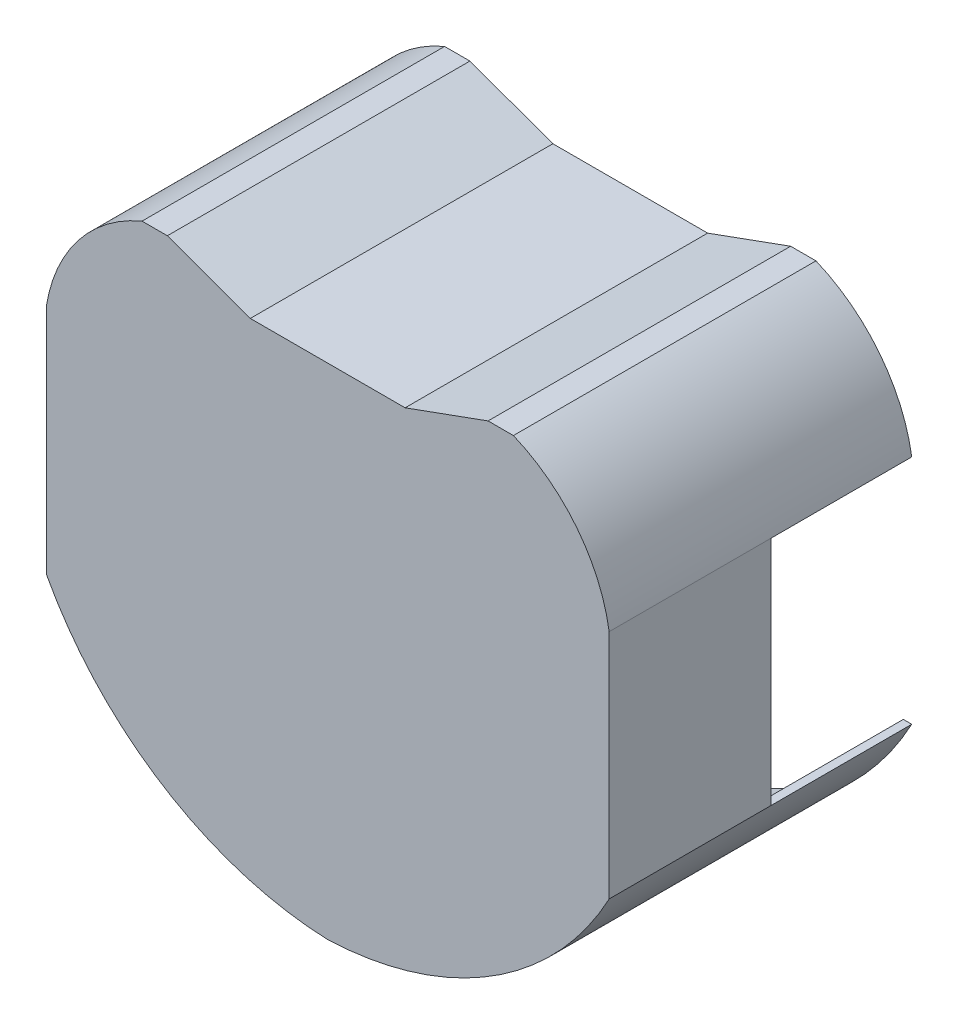
ISO-10303-21;
HEADER;
FILE_DESCRIPTION(('STEP AP214'),'2;1');
FILE_NAME('part.step','',(''),(''),'','','');
FILE_SCHEMA(('AUTOMOTIVE_DESIGN { 1 0 10303 214 1 1 1 1 }'));
ENDSEC;
DATA;
#1=APPLICATION_CONTEXT('core data for automotive mechanical design processes');
#2=APPLICATION_PROTOCOL_DEFINITION('international standard','automotive_design',2000,#1);
#3=PRODUCT_CONTEXT('',#1,'mechanical');
#4=PRODUCT('Part','Part','',(#3));
#5=PRODUCT_RELATED_PRODUCT_CATEGORY('part','',(#4));
#6=PRODUCT_DEFINITION_FORMATION('','',#4);
#7=PRODUCT_DEFINITION_CONTEXT('part definition',#1,'design');
#8=PRODUCT_DEFINITION('design','',#6,#7);
#9=PRODUCT_DEFINITION_SHAPE('','',#8);
#10=(LENGTH_UNIT() NAMED_UNIT(*) SI_UNIT(.MILLI.,.METRE.));
#11=(NAMED_UNIT(*) PLANE_ANGLE_UNIT() SI_UNIT($,.RADIAN.));
#12=(NAMED_UNIT(*) SI_UNIT($,.STERADIAN.) SOLID_ANGLE_UNIT());
#13=UNCERTAINTY_MEASURE_WITH_UNIT(LENGTH_MEASURE(1.E-05),#10,'distance_accuracy_value','');
#14=(GEOMETRIC_REPRESENTATION_CONTEXT(3) GLOBAL_UNCERTAINTY_ASSIGNED_CONTEXT((#13)) GLOBAL_UNIT_ASSIGNED_CONTEXT((#10,
#11,#12)) REPRESENTATION_CONTEXT('',''));
#15=CARTESIAN_POINT('',(0.,0.,0.));
#16=DIRECTION('',(0.,0.,1.));
#17=DIRECTION('',(1.,0.,0.));
#18=AXIS2_PLACEMENT_3D('',#15,#16,#17);
#19=CARTESIAN_POINT('',(-1.26072058426428,9.06990961477015,0.));
#20=DIRECTION('',(0.,0.,-1.));
#21=DIRECTION('',(-1.,0.,0.));
#22=AXIS2_PLACEMENT_3D('',#19,#20,#21);
#23=PLANE('',#22);
#24=DIRECTION('',(-1.,0.,0.));
#25=VECTOR('',#24,1.);
#26=CARTESIAN_POINT('',(-1.15725317286521E-13,-13.3422206927082,0.));
#27=LINE('',#26,#25);
#28=CARTESIAN_POINT('',(-38.2301383103759,-13.3422206927078,0.));
#29=VERTEX_POINT('',#28);
#30=CARTESIAN_POINT('',(-39.4301383103759,-13.3422206927078,0.));
#31=VERTEX_POINT('',#30);
#32=EDGE_CURVE('E50',#29,#31,#27,.T.);
#33=ORIENTED_EDGE('',*,*,#32,.T.);
#34=DIRECTION('',(0.,-1.,0.));
#35=VECTOR('',#34,1.);
#36=CARTESIAN_POINT('',(-39.4301383103759,-13.3422206927079,0.));
#37=LINE('',#36,#35);
#38=CARTESIAN_POINT('',(-39.4301383103759,19.5563760209377,0.));
#39=VERTEX_POINT('',#38);
#40=EDGE_CURVE('E414',#39,#31,#37,.T.);
#41=ORIENTED_EDGE('',*,*,#40,.F.);
#42=DIRECTION('',(1.,0.,0.));
#43=VECTOR('',#42,1.);
#44=CARTESIAN_POINT('',(3.39249045885491E-13,19.556376020937,0.));
#45=LINE('',#44,#43);
#46=CARTESIAN_POINT('',(-38.2301383103759,19.5563760209377,0.));
#47=VERTEX_POINT('',#46);
#48=EDGE_CURVE('E292',#39,#47,#45,.T.);
#49=ORIENTED_EDGE('',*,*,#48,.T.);
#50=DIRECTION('',(0.,-1.,0.));
#51=VECTOR('',#50,1.);
#52=CARTESIAN_POINT('',(-38.2301383103759,19.5563760209377,0.));
#53=LINE('',#52,#51);
#54=EDGE_CURVE('E350',#47,#29,#53,.T.);
#55=ORIENTED_EDGE('',*,*,#54,.T.);
#56=EDGE_LOOP('',(#33,#41,#49,#55));
#57=FACE_BOUND('',#56,.T.);
#58=ADVANCED_FACE('F35',(#57),#23,.T.);
#59=DIRECTION('',(-1.,0.,0.));
#60=VECTOR('',#59,1.);
#61=CARTESIAN_POINT('',(-1.54300423048687E-13,-13.3422206927074,0.));
#62=LINE('',#61,#60);
#63=CARTESIAN_POINT('',(40.569285531916,-13.3422206927079,0.));
#64=VERTEX_POINT('',#63);
#65=CARTESIAN_POINT('',(39.369285531916,-13.3422206927078,0.));
#66=VERTEX_POINT('',#65);
#67=EDGE_CURVE('E265',#64,#66,#62,.T.);
#68=ORIENTED_EDGE('',*,*,#67,.T.);
#69=DIRECTION('',(0.,1.,0.));
#70=VECTOR('',#69,1.);
#71=CARTESIAN_POINT('',(39.369285531916,19.5563760209377,0.));
#72=LINE('',#71,#70);
#73=CARTESIAN_POINT('',(39.369285531916,19.5563760209377,0.));
#74=VERTEX_POINT('',#73);
#75=EDGE_CURVE('E355',#66,#74,#72,.T.);
#76=ORIENTED_EDGE('',*,*,#75,.T.);
#77=DIRECTION('',(-1.,0.,0.));
#78=VECTOR('',#77,1.);
#79=CARTESIAN_POINT('',(-3.39249045885491E-13,19.556376020937,0.));
#80=LINE('',#79,#78);
#81=CARTESIAN_POINT('',(40.569285531916,19.5563760209377,0.));
#82=VERTEX_POINT('',#81);
#83=EDGE_CURVE('E297',#82,#74,#80,.T.);
#84=ORIENTED_EDGE('',*,*,#83,.F.);
#85=DIRECTION('',(0.,1.,0.));
#86=VECTOR('',#85,1.);
#87=CARTESIAN_POINT('',(40.569285531916,-13.3422206927079,0.));
#88=LINE('',#87,#86);
#89=EDGE_CURVE('E58',#64,#82,#88,.T.);
#90=ORIENTED_EDGE('',*,*,#89,.F.);
#91=EDGE_LOOP('',(#68,#76,#84,#90));
#92=FACE_BOUND('',#91,.T.);
#93=ADVANCED_FACE('F449',(#92),#23,.T.);
#94=CARTESIAN_POINT('',(-1.26072058426428,9.06990961477015,20.));
#95=DIRECTION('',(0.,0.,-1.));
#96=DIRECTION('',(-1.,0.,0.));
#97=AXIS2_PLACEMENT_3D('',#94,#95,#96);
#98=CYLINDRICAL_SURFACE('',#97,47.4558004526217);
#99=DIRECTION('',(0.,0.,-1.));
#100=VECTOR('',#99,1.);
#101=CARTESIAN_POINT('',(0.569573610770009,-38.3505819448782,20.));
#102=LINE('',#101,#100);
#103=CARTESIAN_POINT('',(0.569573610769992,-38.3505819448782,23.));
#104=VERTEX_POINT('',#103);
#105=CARTESIAN_POINT('',(0.56957361077001,-38.3505819448782,-20.));
#106=VERTEX_POINT('',#105);
#107=EDGE_CURVE('E416',#104,#106,#102,.T.);
#108=ORIENTED_EDGE('',*,*,#107,.T.);
#109=CARTESIAN_POINT('',(-1.26072058426428,9.06990961477015,-20.));
#110=DIRECTION('',(0.,0.,-1.));
#111=DIRECTION('',(-1.,0.,0.));
#112=AXIS2_PLACEMENT_3D('',#109,#110,#111);
#113=CIRCLE('',#112,47.4558004526217);
#114=CARTESIAN_POINT('',(40.569285531916,-13.3422206927079,-20.));
#115=VERTEX_POINT('',#114);
#116=EDGE_CURVE('E261',#115,#106,#113,.T.);
#117=ORIENTED_EDGE('',*,*,#116,.F.);
#118=DIRECTION('',(0.,0.,1.));
#119=VECTOR('',#118,1.);
#120=CARTESIAN_POINT('',(40.569285531916,-13.3422206927079,-20.));
#121=LINE('',#120,#119);
#122=EDGE_CURVE('E278',#115,#64,#121,.T.);
#123=ORIENTED_EDGE('',*,*,#122,.T.);
#124=DIRECTION('',(0.,0.,-1.));
#125=VECTOR('',#124,1.);
#126=CARTESIAN_POINT('',(40.569285531916,-13.3422206927079,20.));
#127=LINE('',#126,#125);
#128=CARTESIAN_POINT('',(40.569285531916,-13.3422206927079,23.));
#129=VERTEX_POINT('',#128);
#130=EDGE_CURVE('E11',#129,#64,#127,.T.);
#131=ORIENTED_EDGE('',*,*,#130,.F.);
#132=CARTESIAN_POINT('',(-1.26072058426588,9.06990961477269,23.));
#133=DIRECTION('',(0.,0.,1.));
#134=DIRECTION('',(1.,0.,0.));
#135=AXIS2_PLACEMENT_3D('',#132,#133,#134);
#136=CIRCLE('',#135,47.4558004526243);
#137=EDGE_CURVE('E240',#104,#129,#136,.T.);
#138=ORIENTED_EDGE('',*,*,#137,.F.);
#139=EDGE_LOOP('',(#108,#117,#123,#131,#138));
#140=FACE_BOUND('',#139,.T.);
#141=ADVANCED_FACE('F37',(#140),#98,.T.);
#142=CARTESIAN_POINT('',(40.569285531916,-13.3422206927079,20.));
#143=DIRECTION('',(-1.,0.,0.));
#144=DIRECTION('',(0.,0.,1.));
#145=AXIS2_PLACEMENT_3D('',#142,#143,#144);
#146=PLANE('',#145);
#147=ORIENTED_EDGE('',*,*,#89,.T.);
#148=DIRECTION('',(0.,0.,-1.));
#149=VECTOR('',#148,1.);
#150=CARTESIAN_POINT('',(40.569285531916,19.5563760209377,20.));
#151=LINE('',#150,#149);
#152=CARTESIAN_POINT('',(40.569285531916,19.5563760209377,23.));
#153=VERTEX_POINT('',#152);
#154=EDGE_CURVE('E43',#153,#82,#151,.T.);
#155=ORIENTED_EDGE('',*,*,#154,.F.);
#156=DIRECTION('',(0.,1.,0.));
#157=VECTOR('',#156,1.);
#158=CARTESIAN_POINT('',(40.569285531916,19.5563760209377,23.));
#159=LINE('',#158,#157);
#160=EDGE_CURVE('E243',#129,#153,#159,.T.);
#161=ORIENTED_EDGE('',*,*,#160,.F.);
#162=ORIENTED_EDGE('',*,*,#130,.T.);
#163=EDGE_LOOP('',(#147,#155,#161,#162));
#164=FACE_BOUND('',#163,.T.);
#165=ADVANCED_FACE('F438',(#164),#146,.F.);
#166=CARTESIAN_POINT('',(18.232497643377,16.0249171627023,20.));
#167=DIRECTION('',(0.,0.,-1.));
#168=DIRECTION('',(-1.,0.,0.));
#169=AXIS2_PLACEMENT_3D('',#166,#167,#168);
#170=CYLINDRICAL_SURFACE('',#169,22.6142277083475);
#171=ORIENTED_EDGE('',*,*,#154,.T.);
#172=DIRECTION('',(0.,0.,1.));
#173=VECTOR('',#172,1.);
#174=CARTESIAN_POINT('',(40.569285531916,19.5563760209377,-20.));
#175=LINE('',#174,#173);
#176=CARTESIAN_POINT('',(40.569285531916,19.5563760209377,-20.));
#177=VERTEX_POINT('',#176);
#178=EDGE_CURVE('E345',#177,#82,#175,.T.);
#179=ORIENTED_EDGE('',*,*,#178,.F.);
#180=CARTESIAN_POINT('',(18.232497643377,16.0249171627023,-20.));
#181=DIRECTION('',(0.,0.,-1.));
#182=DIRECTION('',(-1.,0.,0.));
#183=AXIS2_PLACEMENT_3D('',#180,#181,#182);
#184=CIRCLE('',#183,22.6142277083475);
#185=CARTESIAN_POINT('',(26.9596123215847,36.8873418597121,-20.));
#186=VERTEX_POINT('',#185);
#187=EDGE_CURVE('E326',#186,#177,#184,.T.);
#188=ORIENTED_EDGE('',*,*,#187,.F.);
#189=DIRECTION('',(0.,0.,-1.));
#190=VECTOR('',#189,1.);
#191=CARTESIAN_POINT('',(26.9596123215847,36.8873418597121,20.));
#192=LINE('',#191,#190);
#193=CARTESIAN_POINT('',(26.9596123215847,36.8873418597121,23.));
#194=VERTEX_POINT('',#193);
#195=EDGE_CURVE('E428',#194,#186,#192,.T.);
#196=ORIENTED_EDGE('',*,*,#195,.F.);
#197=CARTESIAN_POINT('',(18.2324976433767,16.0249171627021,23.));
#198=DIRECTION('',(0.,0.,1.));
#199=DIRECTION('',(-1.,0.,0.));
#200=AXIS2_PLACEMENT_3D('',#197,#198,#199);
#201=CIRCLE('',#200,22.6142277083479);
#202=EDGE_CURVE('E246',#153,#194,#201,.T.);
#203=ORIENTED_EDGE('',*,*,#202,.F.);
#204=EDGE_LOOP('',(#171,#179,#188,#196,#203));
#205=FACE_BOUND('',#204,.T.);
#206=ADVANCED_FACE('F433',(#205),#170,.T.);
#207=CARTESIAN_POINT('',(26.9596123215847,36.8873418597121,20.));
#208=DIRECTION('',(0.,-1.,0.));
#209=DIRECTION('',(0.,0.,-1.));
#210=AXIS2_PLACEMENT_3D('',#207,#208,#209);
#211=PLANE('',#210);
#212=ORIENTED_EDGE('',*,*,#195,.T.);
#213=DIRECTION('',(1.,0.,0.));
#214=VECTOR('',#213,1.);
#215=CARTESIAN_POINT('',(0.,36.8873418597121,-20.));
#216=LINE('',#215,#214);
#217=CARTESIAN_POINT('',(23.3596123215847,36.8873418597121,-20.));
#218=VERTEX_POINT('',#217);
#219=EDGE_CURVE('E323',#218,#186,#216,.T.);
#220=ORIENTED_EDGE('',*,*,#219,.F.);
#221=DIRECTION('',(0.,0.,-1.));
#222=VECTOR('',#221,1.);
#223=CARTESIAN_POINT('',(23.3596123215847,36.8873418597121,20.));
#224=LINE('',#223,#222);
#225=CARTESIAN_POINT('',(23.3596123215847,36.8873418597121,23.));
#226=VERTEX_POINT('',#225);
#227=EDGE_CURVE('E426',#226,#218,#224,.T.);
#228=ORIENTED_EDGE('',*,*,#227,.F.);
#229=DIRECTION('',(-1.,0.,0.));
#230=VECTOR('',#229,1.);
#231=CARTESIAN_POINT('',(23.3596123215847,36.8873418597121,23.));
#232=LINE('',#231,#230);
#233=EDGE_CURVE('E249',#194,#226,#232,.T.);
#234=ORIENTED_EDGE('',*,*,#233,.F.);
#235=EDGE_LOOP('',(#212,#220,#228,#234));
#236=FACE_BOUND('',#235,.T.);
#237=ADVANCED_FACE('F506',(#236),#211,.F.);
#238=CARTESIAN_POINT('',(23.3596123215847,36.8873418597121,20.));
#239=DIRECTION('',(0.341248519019713,-0.939973110395639,0.));
#240=DIRECTION('',(0.939973110395639,0.341248519019713,0.));
#241=AXIS2_PLACEMENT_3D('',#238,#239,#240);
#242=PLANE('',#241);
#243=ORIENTED_EDGE('',*,*,#227,.T.);
#244=DIRECTION('',(0.939973110395639,0.341248519019713,0.));
#245=VECTOR('',#244,1.);
#246=CARTESIAN_POINT('',(-9.11190751062934,25.0988577738234,-20.));
#247=LINE('',#246,#245);
#248=CARTESIAN_POINT('',(11.56957361077,32.6070776641149,-20.));
#249=VERTEX_POINT('',#248);
#250=EDGE_CURVE('E320',#249,#218,#247,.T.);
#251=ORIENTED_EDGE('',*,*,#250,.F.);
#252=DIRECTION('',(0.,0.,-1.));
#253=VECTOR('',#252,1.);
#254=CARTESIAN_POINT('',(11.56957361077,32.6070776641149,20.));
#255=LINE('',#254,#253);
#256=CARTESIAN_POINT('',(11.56957361077,32.6070776641149,23.));
#257=VERTEX_POINT('',#256);
#258=EDGE_CURVE('E424',#257,#249,#255,.T.);
#259=ORIENTED_EDGE('',*,*,#258,.F.);
#260=DIRECTION('',(-0.939973110395639,-0.341248519019713,0.));
#261=VECTOR('',#260,1.);
#262=CARTESIAN_POINT('',(11.56957361077,32.6070776641149,23.));
#263=LINE('',#262,#261);
#264=EDGE_CURVE('E252',#226,#257,#263,.T.);
#265=ORIENTED_EDGE('',*,*,#264,.F.);
#266=EDGE_LOOP('',(#243,#251,#259,#265));
#267=FACE_BOUND('',#266,.T.);
#268=ADVANCED_FACE('F510',(#267),#242,.F.);
#269=CARTESIAN_POINT('',(-10.43042638923,32.6070776641149,20.));
#270=DIRECTION('',(0.,-1.,0.));
#271=DIRECTION('',(0.,0.,-1.));
#272=AXIS2_PLACEMENT_3D('',#269,#270,#271);
#273=PLANE('',#272);
#274=ORIENTED_EDGE('',*,*,#258,.T.);
#275=DIRECTION('',(1.,0.,0.));
#276=VECTOR('',#275,1.);
#277=CARTESIAN_POINT('',(0.,32.6070776641149,-20.));
#278=LINE('',#277,#276);
#279=CARTESIAN_POINT('',(-10.43042638923,32.6070776641149,-20.));
#280=VERTEX_POINT('',#279);
#281=EDGE_CURVE('E317',#280,#249,#278,.T.);
#282=ORIENTED_EDGE('',*,*,#281,.F.);
#283=DIRECTION('',(0.,0.,-1.));
#284=VECTOR('',#283,1.);
#285=CARTESIAN_POINT('',(-10.43042638923,32.6070776641149,20.));
#286=LINE('',#285,#284);
#287=CARTESIAN_POINT('',(-10.43042638923,32.6070776641149,23.));
#288=VERTEX_POINT('',#287);
#289=EDGE_CURVE('E422',#288,#280,#286,.T.);
#290=ORIENTED_EDGE('',*,*,#289,.F.);
#291=DIRECTION('',(-1.,0.,0.));
#292=VECTOR('',#291,1.);
#293=CARTESIAN_POINT('',(-10.43042638923,32.6070776641149,23.));
#294=LINE('',#293,#292);
#295=EDGE_CURVE('E255',#257,#288,#294,.T.);
#296=ORIENTED_EDGE('',*,*,#295,.F.);
#297=EDGE_LOOP('',(#274,#282,#290,#296));
#298=FACE_BOUND('',#297,.T.);
#299=ADVANCED_FACE('F514',(#298),#273,.F.);
#300=CARTESIAN_POINT('',(-22.2204651000446,36.8873418597121,20.));
#301=DIRECTION('',(-0.341248519019713,-0.939973110395639,0.));
#302=DIRECTION('',(0.939973110395639,-0.341248519019713,0.));
#303=AXIS2_PLACEMENT_3D('',#300,#301,#302);
#304=PLANE('',#303);
#305=ORIENTED_EDGE('',*,*,#289,.T.);
#306=DIRECTION('',(0.939973110395639,-0.341248519019713,0.));
#307=VECTOR('',#306,1.);
#308=CARTESIAN_POINT('',(9.24456183308297,25.4642556851238,-20.));
#309=LINE('',#308,#307);
#310=CARTESIAN_POINT('',(-22.2204651000446,36.8873418597121,-20.));
#311=VERTEX_POINT('',#310);
#312=EDGE_CURVE('E314',#311,#280,#309,.T.);
#313=ORIENTED_EDGE('',*,*,#312,.F.);
#314=DIRECTION('',(0.,0.,-1.));
#315=VECTOR('',#314,1.);
#316=CARTESIAN_POINT('',(-22.2204651000446,36.8873418597121,20.));
#317=LINE('',#316,#315);
#318=CARTESIAN_POINT('',(-22.2204651000446,36.8873418597121,23.));
#319=VERTEX_POINT('',#318);
#320=EDGE_CURVE('E420',#319,#311,#317,.T.);
#321=ORIENTED_EDGE('',*,*,#320,.F.);
#322=DIRECTION('',(-0.939973110395639,0.341248519019713,0.));
#323=VECTOR('',#322,1.);
#324=CARTESIAN_POINT('',(-22.2204651000446,36.8873418597121,23.));
#325=LINE('',#324,#323);
#326=EDGE_CURVE('E258',#288,#319,#325,.T.);
#327=ORIENTED_EDGE('',*,*,#326,.F.);
#328=EDGE_LOOP('',(#305,#313,#321,#327));
#329=FACE_BOUND('',#328,.T.);
#330=ADVANCED_FACE('F518',(#329),#304,.F.);
#331=CARTESIAN_POINT('',(-25.8204651000446,36.8873418597121,20.));
#332=DIRECTION('',(0.,-1.,0.));
#333=DIRECTION('',(0.,0.,-1.));
#334=AXIS2_PLACEMENT_3D('',#331,#332,#333);
#335=PLANE('',#334);
#336=ORIENTED_EDGE('',*,*,#320,.T.);
#337=DIRECTION('',(1.,0.,0.));
#338=VECTOR('',#337,1.);
#339=CARTESIAN_POINT('',(0.,36.8873418597121,-20.));
#340=LINE('',#339,#338);
#341=CARTESIAN_POINT('',(-25.8204651000446,36.8873418597121,-20.));
#342=VERTEX_POINT('',#341);
#343=EDGE_CURVE('E311',#342,#311,#340,.T.);
#344=ORIENTED_EDGE('',*,*,#343,.F.);
#345=DIRECTION('',(0.,0.,-1.));
#346=VECTOR('',#345,1.);
#347=CARTESIAN_POINT('',(-25.8204651000446,36.8873418597121,20.));
#348=LINE('',#347,#346);
#349=CARTESIAN_POINT('',(-25.8204651000446,36.8873418597121,23.));
#350=VERTEX_POINT('',#349);
#351=EDGE_CURVE('E220',#350,#342,#348,.T.);
#352=ORIENTED_EDGE('',*,*,#351,.F.);
#353=DIRECTION('',(-1.,0.,0.));
#354=VECTOR('',#353,1.);
#355=CARTESIAN_POINT('',(-25.8204651000446,36.8873418597121,23.));
#356=LINE('',#355,#354);
#357=EDGE_CURVE('E236',#319,#350,#356,.T.);
#358=ORIENTED_EDGE('',*,*,#357,.F.);
#359=EDGE_LOOP('',(#336,#344,#352,#358));
#360=FACE_BOUND('',#359,.T.);
#361=ADVANCED_FACE('F521',(#360),#335,.F.);
#362=CARTESIAN_POINT('',(-17.0933504218369,16.0249171627023,20.));
#363=DIRECTION('',(0.,0.,-1.));
#364=DIRECTION('',(-1.,0.,0.));
#365=AXIS2_PLACEMENT_3D('',#362,#363,#364);
#366=CYLINDRICAL_SURFACE('',#365,22.6142277083475);
#367=ORIENTED_EDGE('',*,*,#351,.T.);
#368=CARTESIAN_POINT('',(-17.0933504218369,16.0249171627023,-20.));
#369=DIRECTION('',(0.,0.,-1.));
#370=DIRECTION('',(-1.,0.,0.));
#371=AXIS2_PLACEMENT_3D('',#368,#369,#370);
#372=CIRCLE('',#371,22.6142277083475);
#373=CARTESIAN_POINT('',(-39.4301383103759,19.5563760209377,-20.));
#374=VERTEX_POINT('',#373);
#375=EDGE_CURVE('E308',#374,#342,#372,.T.);
#376=ORIENTED_EDGE('',*,*,#375,.F.);
#377=DIRECTION('',(0.,0.,1.));
#378=VECTOR('',#377,1.);
#379=CARTESIAN_POINT('',(-39.4301383103759,19.5563760209377,-20.));
#380=LINE('',#379,#378);
#381=EDGE_CURVE('E217',#374,#39,#380,.T.);
#382=ORIENTED_EDGE('',*,*,#381,.T.);
#383=DIRECTION('',(0.,0.,-1.));
#384=VECTOR('',#383,1.);
#385=CARTESIAN_POINT('',(-39.4301383103759,19.5563760209377,20.));
#386=LINE('',#385,#384);
#387=CARTESIAN_POINT('',(-39.4301383103759,19.5563760209377,23.));
#388=VERTEX_POINT('',#387);
#389=EDGE_CURVE('E211',#388,#39,#386,.T.);
#390=ORIENTED_EDGE('',*,*,#389,.F.);
#391=CARTESIAN_POINT('',(-17.0933504218364,16.024917162702,23.));
#392=DIRECTION('',(0.,0.,1.));
#393=DIRECTION('',(-1.,0.,0.));
#394=AXIS2_PLACEMENT_3D('',#391,#392,#393);
#395=CIRCLE('',#394,22.614227708348);
#396=EDGE_CURVE('E215',#350,#388,#395,.T.);
#397=ORIENTED_EDGE('',*,*,#396,.F.);
#398=EDGE_LOOP('',(#367,#376,#382,#390,#397));
#399=FACE_BOUND('',#398,.T.);
#400=ADVANCED_FACE('F213',(#399),#366,.T.);
#401=CARTESIAN_POINT('',(-39.4301383103759,-13.3422206927079,20.));
#402=DIRECTION('',(1.,0.,0.));
#403=DIRECTION('',(0.,0.,-1.));
#404=AXIS2_PLACEMENT_3D('',#401,#402,#403);
#405=PLANE('',#404);
#406=ORIENTED_EDGE('',*,*,#40,.T.);
#407=DIRECTION('',(0.,0.,-1.));
#408=VECTOR('',#407,1.);
#409=CARTESIAN_POINT('',(-39.4301383103759,-13.3422206927078,20.));
#410=LINE('',#409,#408);
#411=CARTESIAN_POINT('',(-39.4301383103759,-13.3422206927078,23.));
#412=VERTEX_POINT('',#411);
#413=EDGE_CURVE('E221',#412,#31,#410,.T.);
#414=ORIENTED_EDGE('',*,*,#413,.F.);
#415=DIRECTION('',(0.,-1.,0.));
#416=VECTOR('',#415,1.);
#417=CARTESIAN_POINT('',(-39.4301383103759,-13.3422206927078,23.));
#418=LINE('',#417,#416);
#419=EDGE_CURVE('E224',#388,#412,#418,.T.);
#420=ORIENTED_EDGE('',*,*,#419,.F.);
#421=ORIENTED_EDGE('',*,*,#389,.T.);
#422=EDGE_LOOP('',(#406,#414,#420,#421));
#423=FACE_BOUND('',#422,.T.);
#424=ADVANCED_FACE('F225',(#423),#405,.F.);
#425=CARTESIAN_POINT('',(2.39986780580436,9.06990961477015,20.));
#426=DIRECTION('',(0.,0.,-1.));
#427=DIRECTION('',(-1.,0.,0.));
#428=AXIS2_PLACEMENT_3D('',#425,#426,#427);
#429=CYLINDRICAL_SURFACE('',#428,47.4558004526217);
#430=ORIENTED_EDGE('',*,*,#413,.T.);
#431=DIRECTION('',(0.,0.,1.));
#432=VECTOR('',#431,1.);
#433=CARTESIAN_POINT('',(-39.4301383103759,-13.3422206927078,-20.));
#434=LINE('',#433,#432);
#435=CARTESIAN_POINT('',(-39.4301383103759,-13.3422206927078,-20.));
#436=VERTEX_POINT('',#435);
#437=EDGE_CURVE('E289',#436,#31,#434,.T.);
#438=ORIENTED_EDGE('',*,*,#437,.F.);
#439=CARTESIAN_POINT('',(2.39986780580436,9.06990961477015,-20.));
#440=DIRECTION('',(0.,0.,-1.));
#441=DIRECTION('',(-1.,0.,0.));
#442=AXIS2_PLACEMENT_3D('',#439,#440,#441);
#443=CIRCLE('',#442,47.4558004526217);
#444=EDGE_CURVE('E264',#106,#436,#443,.T.);
#445=ORIENTED_EDGE('',*,*,#444,.F.);
#446=ORIENTED_EDGE('',*,*,#107,.F.);
#447=CARTESIAN_POINT('',(2.39986780580502,9.0699096147712,23.));
#448=DIRECTION('',(0.,0.,1.));
#449=DIRECTION('',(1.,0.,0.));
#450=AXIS2_PLACEMENT_3D('',#447,#448,#449);
#451=CIRCLE('',#450,47.4558004526228);
#452=EDGE_CURVE('E230',#412,#104,#451,.T.);
#453=ORIENTED_EDGE('',*,*,#452,.F.);
#454=EDGE_LOOP('',(#430,#438,#445,#446,#453));
#455=FACE_BOUND('',#454,.T.);
#456=ADVANCED_FACE('F538',(#455),#429,.T.);
#457=CARTESIAN_POINT('',(-15.4816356110987,13.1290996648623,20.));
#458=DIRECTION('',(0.,0.,-1.));
#459=DIRECTION('',(-1.,0.,0.));
#460=AXIS2_PLACEMENT_3D('',#457,#458,#459);
#461=CYLINDRICAL_SURFACE('',#460,23.6390409368991);
#462=DIRECTION('',(0.,0.,-1.));
#463=VECTOR('',#462,1.);
#464=CARTESIAN_POINT('',(-38.2301383103759,19.5563760209377,20.));
#465=LINE('',#464,#463);
#466=CARTESIAN_POINT('',(-38.2301383103759,19.5563760209377,20.));
#467=VERTEX_POINT('',#466);
#468=EDGE_CURVE('E410',#467,#47,#465,.T.);
#469=ORIENTED_EDGE('',*,*,#468,.T.);
#470=DIRECTION('',(0.,0.,1.));
#471=VECTOR('',#470,1.);
#472=CARTESIAN_POINT('',(-38.2301383103759,19.5563760209377,-20.));
#473=LINE('',#472,#471);
#474=CARTESIAN_POINT('',(-38.2301383103759,19.5563760209377,-20.));
#475=VERTEX_POINT('',#474);
#476=EDGE_CURVE('E348',#475,#47,#473,.T.);
#477=ORIENTED_EDGE('',*,*,#476,.F.);
#478=CARTESIAN_POINT('',(-15.4816356110987,13.1290996648623,-20.));
#479=DIRECTION('',(0.,0.,-1.));
#480=DIRECTION('',(-1.,0.,0.));
#481=AXIS2_PLACEMENT_3D('',#478,#479,#480);
#482=CIRCLE('',#481,23.6390409368991);
#483=CARTESIAN_POINT('',(-25.8204651000446,34.3873418597121,-20.));
#484=VERTEX_POINT('',#483);
#485=EDGE_CURVE('E303',#484,#475,#482,.F.);
#486=ORIENTED_EDGE('',*,*,#485,.F.);
#487=DIRECTION('',(0.,0.,-1.));
#488=VECTOR('',#487,1.);
#489=CARTESIAN_POINT('',(-25.8204651000446,34.3873418597121,20.));
#490=LINE('',#489,#488);
#491=CARTESIAN_POINT('',(-25.8204651000446,34.3873418597121,20.));
#492=VERTEX_POINT('',#491);
#493=EDGE_CURVE('E385',#492,#484,#490,.T.);
#494=ORIENTED_EDGE('',*,*,#493,.F.);
#495=CARTESIAN_POINT('',(-15.4816356110987,13.1290996648623,20.));
#496=DIRECTION('',(0.,0.,1.));
#497=DIRECTION('',(-1.,0.,0.));
#498=AXIS2_PLACEMENT_3D('',#495,#496,#497);
#499=CIRCLE('',#498,23.6390409368991);
#500=EDGE_CURVE('E351',#492,#467,#499,.T.);
#501=ORIENTED_EDGE('',*,*,#500,.T.);
#502=EDGE_LOOP('',(#469,#477,#486,#494,#501));
#503=FACE_BOUND('',#502,.T.);
#504=ADVANCED_FACE('F474',(#503),#461,.F.);
#505=CARTESIAN_POINT('',(-38.2301383103759,19.5563760209377,20.));
#506=DIRECTION('',(1.,0.,0.));
#507=DIRECTION('',(0.,0.,-1.));
#508=AXIS2_PLACEMENT_3D('',#505,#506,#507);
#509=PLANE('',#508);
#510=ORIENTED_EDGE('',*,*,#54,.F.);
#511=ORIENTED_EDGE('',*,*,#468,.F.);
#512=DIRECTION('',(0.,-1.,0.));
#513=VECTOR('',#512,1.);
#514=CARTESIAN_POINT('',(-38.2301383103759,19.5563760209377,20.));
#515=LINE('',#514,#513);
#516=CARTESIAN_POINT('',(-38.2301383103759,-13.3422206927078,20.));
#517=VERTEX_POINT('',#516);
#518=EDGE_CURVE('E354',#467,#517,#515,.T.);
#519=ORIENTED_EDGE('',*,*,#518,.T.);
#520=DIRECTION('',(0.,0.,-1.));
#521=VECTOR('',#520,1.);
#522=CARTESIAN_POINT('',(-38.2301383103759,-13.3422206927078,20.));
#523=LINE('',#522,#521);
#524=EDGE_CURVE('E408',#517,#29,#523,.T.);
#525=ORIENTED_EDGE('',*,*,#524,.T.);
#526=EDGE_LOOP('',(#510,#511,#519,#525));
#527=FACE_BOUND('',#526,.T.);
#528=ADVANCED_FACE('F466',(#527),#509,.T.);
#529=CARTESIAN_POINT('',(0.0238931868070599,7.90425793114009,20.));
#530=DIRECTION('',(0.,0.,-1.));
#531=DIRECTION('',(-1.,0.,0.));
#532=AXIS2_PLACEMENT_3D('',#529,#530,#531);
#533=CYLINDRICAL_SURFACE('',#532,43.7582424201555);
#534=DIRECTION('',(0.,0.,-1.));
#535=VECTOR('',#534,1.);
#536=CARTESIAN_POINT('',(0.569573610770058,-35.8505819448782,20.));
#537=LINE('',#536,#535);
#538=CARTESIAN_POINT('',(0.569573610770058,-35.8505819448782,20.));
#539=VERTEX_POINT('',#538);
#540=CARTESIAN_POINT('',(0.569573610770061,-35.8505819448782,-20.));
#541=VERTEX_POINT('',#540);
#542=EDGE_CURVE('E406',#539,#541,#537,.T.);
#543=ORIENTED_EDGE('',*,*,#542,.T.);
#544=CARTESIAN_POINT('',(0.0238931868070599,7.90425793114009,-20.));
#545=DIRECTION('',(0.,0.,-1.));
#546=DIRECTION('',(-1.,0.,0.));
#547=AXIS2_PLACEMENT_3D('',#544,#545,#546);
#548=CIRCLE('',#547,43.7582424201555);
#549=CARTESIAN_POINT('',(-38.2301383103759,-13.3422206927078,-20.));
#550=VERTEX_POINT('',#549);
#551=EDGE_CURVE('E270',#550,#541,#548,.F.);
#552=ORIENTED_EDGE('',*,*,#551,.F.);
#553=DIRECTION('',(0.,0.,1.));
#554=VECTOR('',#553,1.);
#555=CARTESIAN_POINT('',(-38.2301383103759,-13.3422206927078,-20.));
#556=LINE('',#555,#554);
#557=EDGE_CURVE('E286',#550,#29,#556,.T.);
#558=ORIENTED_EDGE('',*,*,#557,.T.);
#559=ORIENTED_EDGE('',*,*,#524,.F.);
#560=CARTESIAN_POINT('',(0.0238931868070599,7.90425793114009,20.));
#561=DIRECTION('',(0.,0.,1.));
#562=DIRECTION('',(1.,0.,0.));
#563=AXIS2_PLACEMENT_3D('',#560,#561,#562);
#564=CIRCLE('',#563,43.7582424201555);
#565=EDGE_CURVE('E358',#517,#539,#564,.T.);
#566=ORIENTED_EDGE('',*,*,#565,.T.);
#567=EDGE_LOOP('',(#543,#552,#558,#559,#566));
#568=FACE_BOUND('',#567,.T.);
#569=ADVANCED_FACE('F462',(#568),#533,.F.);
#570=CARTESIAN_POINT('',(1.11525403473301,7.90425793114009,20.));
#571=DIRECTION('',(0.,0.,-1.));
#572=DIRECTION('',(-1.,0.,0.));
#573=AXIS2_PLACEMENT_3D('',#570,#571,#572);
#574=CYLINDRICAL_SURFACE('',#573,43.7582424201555);
#575=DIRECTION('',(0.,0.,-1.));
#576=VECTOR('',#575,1.);
#577=CARTESIAN_POINT('',(39.369285531916,-13.3422206927078,20.));
#578=LINE('',#577,#576);
#579=CARTESIAN_POINT('',(39.369285531916,-13.3422206927078,20.));
#580=VERTEX_POINT('',#579);
#581=EDGE_CURVE('E403',#580,#66,#578,.T.);
#582=ORIENTED_EDGE('',*,*,#581,.T.);
#583=DIRECTION('',(0.,0.,1.));
#584=VECTOR('',#583,1.);
#585=CARTESIAN_POINT('',(39.369285531916,-13.3422206927078,-20.));
#586=LINE('',#585,#584);
#587=CARTESIAN_POINT('',(39.369285531916,-13.3422206927078,-20.));
#588=VERTEX_POINT('',#587);
#589=EDGE_CURVE('E283',#588,#66,#586,.T.);
#590=ORIENTED_EDGE('',*,*,#589,.F.);
#591=CARTESIAN_POINT('',(1.11525403473301,7.90425793114009,-20.));
#592=DIRECTION('',(0.,0.,-1.));
#593=DIRECTION('',(-1.,0.,0.));
#594=AXIS2_PLACEMENT_3D('',#591,#592,#593);
#595=CIRCLE('',#594,43.7582424201555);
#596=EDGE_CURVE('E273',#541,#588,#595,.F.);
#597=ORIENTED_EDGE('',*,*,#596,.F.);
#598=ORIENTED_EDGE('',*,*,#542,.F.);
#599=CARTESIAN_POINT('',(1.11525403473301,7.90425793114009,20.));
#600=DIRECTION('',(0.,0.,1.));
#601=DIRECTION('',(-1.,0.,0.));
#602=AXIS2_PLACEMENT_3D('',#599,#600,#601);
#603=CIRCLE('',#602,43.7582424201555);
#604=EDGE_CURVE('E361',#539,#580,#603,.T.);
#605=ORIENTED_EDGE('',*,*,#604,.T.);
#606=EDGE_LOOP('',(#582,#590,#597,#598,#605));
#607=FACE_BOUND('',#606,.T.);
#608=ADVANCED_FACE('F455',(#607),#574,.F.);
#609=CARTESIAN_POINT('',(39.369285531916,19.5563760209377,20.));
#610=DIRECTION('',(-1.,0.,0.));
#611=DIRECTION('',(0.,0.,1.));
#612=AXIS2_PLACEMENT_3D('',#609,#610,#611);
#613=PLANE('',#612);
#614=ORIENTED_EDGE('',*,*,#75,.F.);
#615=ORIENTED_EDGE('',*,*,#581,.F.);
#616=DIRECTION('',(0.,1.,0.));
#617=VECTOR('',#616,1.);
#618=CARTESIAN_POINT('',(39.369285531916,19.5563760209377,20.));
#619=LINE('',#618,#617);
#620=CARTESIAN_POINT('',(39.369285531916,19.5563760209377,20.));
#621=VERTEX_POINT('',#620);
#622=EDGE_CURVE('E364',#580,#621,#619,.T.);
#623=ORIENTED_EDGE('',*,*,#622,.T.);
#624=DIRECTION('',(0.,0.,-1.));
#625=VECTOR('',#624,1.);
#626=CARTESIAN_POINT('',(39.369285531916,19.5563760209377,20.));
#627=LINE('',#626,#625);
#628=EDGE_CURVE('E400',#621,#74,#627,.T.);
#629=ORIENTED_EDGE('',*,*,#628,.T.);
#630=EDGE_LOOP('',(#614,#615,#623,#629));
#631=FACE_BOUND('',#630,.T.);
#632=ADVANCED_FACE('F452',(#631),#613,.T.);
#633=CARTESIAN_POINT('',(16.6207828326387,13.1290996648623,20.));
#634=DIRECTION('',(0.,0.,-1.));
#635=DIRECTION('',(-1.,0.,0.));
#636=AXIS2_PLACEMENT_3D('',#633,#634,#635);
#637=CYLINDRICAL_SURFACE('',#636,23.6390409368991);
#638=DIRECTION('',(0.,0.,-1.));
#639=VECTOR('',#638,1.);
#640=CARTESIAN_POINT('',(26.9596123215847,34.3873418597121,20.));
#641=LINE('',#640,#639);
#642=CARTESIAN_POINT('',(26.9596123215847,34.3873418597121,20.));
#643=VERTEX_POINT('',#642);
#644=CARTESIAN_POINT('',(26.9596123215847,34.3873418597121,-20.));
#645=VERTEX_POINT('',#644);
#646=EDGE_CURVE('E398',#643,#645,#641,.T.);
#647=ORIENTED_EDGE('',*,*,#646,.T.);
#648=CARTESIAN_POINT('',(16.6207828326387,13.1290996648623,-20.));
#649=DIRECTION('',(0.,0.,-1.));
#650=DIRECTION('',(-1.,0.,0.));
#651=AXIS2_PLACEMENT_3D('',#648,#649,#650);
#652=CIRCLE('',#651,23.6390409368991);
#653=CARTESIAN_POINT('',(39.369285531916,19.5563760209377,-20.));
#654=VERTEX_POINT('',#653);
#655=EDGE_CURVE('E330',#654,#645,#652,.F.);
#656=ORIENTED_EDGE('',*,*,#655,.F.);
#657=DIRECTION('',(0.,0.,1.));
#658=VECTOR('',#657,1.);
#659=CARTESIAN_POINT('',(39.369285531916,19.5563760209377,-20.));
#660=LINE('',#659,#658);
#661=EDGE_CURVE('E339',#654,#74,#660,.T.);
#662=ORIENTED_EDGE('',*,*,#661,.T.);
#663=ORIENTED_EDGE('',*,*,#628,.F.);
#664=CARTESIAN_POINT('',(16.6207828326387,13.1290996648623,20.));
#665=DIRECTION('',(0.,0.,1.));
#666=DIRECTION('',(1.,0.,0.));
#667=AXIS2_PLACEMENT_3D('',#664,#665,#666);
#668=CIRCLE('',#667,23.6390409368991);
#669=EDGE_CURVE('E367',#621,#643,#668,.T.);
#670=ORIENTED_EDGE('',*,*,#669,.T.);
#671=EDGE_LOOP('',(#647,#656,#662,#663,#670));
#672=FACE_BOUND('',#671,.T.);
#673=ADVANCED_FACE('F500',(#672),#637,.F.);
#674=CARTESIAN_POINT('',(26.9596123215847,34.3873418597121,20.));
#675=DIRECTION('',(0.,-1.,0.));
#676=DIRECTION('',(0.,0.,-1.));
#677=AXIS2_PLACEMENT_3D('',#674,#675,#676);
#678=PLANE('',#677);
#679=DIRECTION('',(0.,0.,-1.));
#680=VECTOR('',#679,1.);
#681=CARTESIAN_POINT('',(23.3596123215847,34.3873418597121,20.));
#682=LINE('',#681,#680);
#683=CARTESIAN_POINT('',(23.3596123215847,34.3873418597121,20.));
#684=VERTEX_POINT('',#683);
#685=CARTESIAN_POINT('',(23.3596123215847,34.3873418597121,-20.));
#686=VERTEX_POINT('',#685);
#687=EDGE_CURVE('E396',#684,#686,#682,.T.);
#688=ORIENTED_EDGE('',*,*,#687,.T.);
#689=DIRECTION('',(-1.,0.,0.));
#690=VECTOR('',#689,1.);
#691=CARTESIAN_POINT('',(0.,34.3873418597121,-20.));
#692=LINE('',#691,#690);
#693=EDGE_CURVE('E333',#645,#686,#692,.T.);
#694=ORIENTED_EDGE('',*,*,#693,.F.);
#695=ORIENTED_EDGE('',*,*,#646,.F.);
#696=DIRECTION('',(-1.,0.,0.));
#697=VECTOR('',#696,1.);
#698=CARTESIAN_POINT('',(26.9596123215847,34.3873418597121,20.));
#699=LINE('',#698,#697);
#700=EDGE_CURVE('E370',#643,#684,#699,.T.);
#701=ORIENTED_EDGE('',*,*,#700,.T.);
#702=EDGE_LOOP('',(#688,#694,#695,#701));
#703=FACE_BOUND('',#702,.T.);
#704=ADVANCED_FACE('F498',(#703),#678,.T.);
#705=CARTESIAN_POINT('',(23.3596123215847,34.3873418597121,20.));
#706=DIRECTION('',(0.341248519019713,-0.939973110395639,0.));
#707=DIRECTION('',(0.939973110395639,0.341248519019713,0.));
#708=AXIS2_PLACEMENT_3D('',#705,#706,#707);
#709=PLANE('',#708);
#710=DIRECTION('',(0.,0.,-1.));
#711=VECTOR('',#710,1.);
#712=CARTESIAN_POINT('',(11.56957361077,30.1070776641149,20.));
#713=LINE('',#712,#711);
#714=CARTESIAN_POINT('',(11.56957361077,30.1070776641149,20.));
#715=VERTEX_POINT('',#714);
#716=CARTESIAN_POINT('',(11.56957361077,30.1070776641149,-20.));
#717=VERTEX_POINT('',#716);
#718=EDGE_CURVE('E394',#715,#717,#713,.T.);
#719=ORIENTED_EDGE('',*,*,#718,.T.);
#720=DIRECTION('',(-0.939973110395639,-0.341248519019713,0.));
#721=VECTOR('',#720,1.);
#722=CARTESIAN_POINT('',(-8.30999643102718,22.8899841531563,-20.));
#723=LINE('',#722,#721);
#724=EDGE_CURVE('E336',#686,#717,#723,.T.);
#725=ORIENTED_EDGE('',*,*,#724,.F.);
#726=ORIENTED_EDGE('',*,*,#687,.F.);
#727=DIRECTION('',(-0.939973110395639,-0.341248519019713,0.));
#728=VECTOR('',#727,1.);
#729=CARTESIAN_POINT('',(23.3596123215847,34.3873418597121,20.));
#730=LINE('',#729,#728);
#731=EDGE_CURVE('E373',#684,#715,#730,.T.);
#732=ORIENTED_EDGE('',*,*,#731,.T.);
#733=EDGE_LOOP('',(#719,#725,#726,#732));
#734=FACE_BOUND('',#733,.T.);
#735=ADVANCED_FACE('F490',(#734),#709,.T.);
#736=CARTESIAN_POINT('',(-10.43042638923,30.1070776641149,20.));
#737=DIRECTION('',(0.,-1.,0.));
#738=DIRECTION('',(0.,0.,-1.));
#739=AXIS2_PLACEMENT_3D('',#736,#737,#738);
#740=PLANE('',#739);
#741=DIRECTION('',(0.,0.,-1.));
#742=VECTOR('',#741,1.);
#743=CARTESIAN_POINT('',(-10.43042638923,30.1070776641149,20.));
#744=LINE('',#743,#742);
#745=CARTESIAN_POINT('',(-10.43042638923,30.1070776641149,20.));
#746=VERTEX_POINT('',#745);
#747=CARTESIAN_POINT('',(-10.43042638923,30.1070776641149,-20.));
#748=VERTEX_POINT('',#747);
#749=EDGE_CURVE('E392',#746,#748,#744,.T.);
#750=ORIENTED_EDGE('',*,*,#749,.T.);
#751=DIRECTION('',(-1.,0.,0.));
#752=VECTOR('',#751,1.);
#753=CARTESIAN_POINT('',(0.,30.1070776641149,-20.));
#754=LINE('',#753,#752);
#755=EDGE_CURVE('E293',#717,#748,#754,.T.);
#756=ORIENTED_EDGE('',*,*,#755,.F.);
#757=ORIENTED_EDGE('',*,*,#718,.F.);
#758=DIRECTION('',(-1.,0.,0.));
#759=VECTOR('',#758,1.);
#760=CARTESIAN_POINT('',(-10.43042638923,30.1070776641149,20.));
#761=LINE('',#760,#759);
#762=EDGE_CURVE('E376',#715,#746,#761,.T.);
#763=ORIENTED_EDGE('',*,*,#762,.T.);
#764=EDGE_LOOP('',(#750,#756,#757,#763));
#765=FACE_BOUND('',#764,.T.);
#766=ADVANCED_FACE('F486',(#765),#740,.T.);
#767=CARTESIAN_POINT('',(-22.2204651000446,34.3873418597121,20.));
#768=DIRECTION('',(-0.341248519019713,-0.939973110395639,0.));
#769=DIRECTION('',(0.939973110395639,-0.341248519019713,0.));
#770=AXIS2_PLACEMENT_3D('',#767,#768,#769);
#771=PLANE('',#770);
#772=DIRECTION('',(0.,0.,-1.));
#773=VECTOR('',#772,1.);
#774=CARTESIAN_POINT('',(-22.2204651000446,34.3873418597121,20.));
#775=LINE('',#774,#773);
#776=CARTESIAN_POINT('',(-22.2204651000446,34.3873418597121,20.));
#777=VERTEX_POINT('',#776);
#778=CARTESIAN_POINT('',(-22.2204651000446,34.3873418597121,-20.));
#779=VERTEX_POINT('',#778);
#780=EDGE_CURVE('E390',#777,#779,#775,.T.);
#781=ORIENTED_EDGE('',*,*,#780,.T.);
#782=DIRECTION('',(-0.939973110395639,0.341248519019713,0.));
#783=VECTOR('',#782,1.);
#784=CARTESIAN_POINT('',(8.4426507534808,23.2553820644567,-20.));
#785=LINE('',#784,#783);
#786=EDGE_CURVE('E296',#748,#779,#785,.T.);
#787=ORIENTED_EDGE('',*,*,#786,.F.);
#788=ORIENTED_EDGE('',*,*,#749,.F.);
#789=DIRECTION('',(-0.939973110395639,0.341248519019713,0.));
#790=VECTOR('',#789,1.);
#791=CARTESIAN_POINT('',(-22.2204651000446,34.3873418597121,20.));
#792=LINE('',#791,#790);
#793=EDGE_CURVE('E379',#746,#777,#792,.T.);
#794=ORIENTED_EDGE('',*,*,#793,.T.);
#795=EDGE_LOOP('',(#781,#787,#788,#794));
#796=FACE_BOUND('',#795,.T.);
#797=ADVANCED_FACE('F483',(#796),#771,.T.);
#798=CARTESIAN_POINT('',(-25.8204651000446,34.3873418597121,20.));
#799=DIRECTION('',(0.,-1.,0.));
#800=DIRECTION('',(0.,0.,-1.));
#801=AXIS2_PLACEMENT_3D('',#798,#799,#800);
#802=PLANE('',#801);
#803=ORIENTED_EDGE('',*,*,#493,.T.);
#804=DIRECTION('',(-1.,0.,0.));
#805=VECTOR('',#804,1.);
#806=CARTESIAN_POINT('',(0.,34.3873418597121,-20.));
#807=LINE('',#806,#805);
#808=EDGE_CURVE('E300',#779,#484,#807,.T.);
#809=ORIENTED_EDGE('',*,*,#808,.F.);
#810=ORIENTED_EDGE('',*,*,#780,.F.);
#811=DIRECTION('',(-1.,0.,0.));
#812=VECTOR('',#811,1.);
#813=CARTESIAN_POINT('',(-25.8204651000446,34.3873418597121,20.));
#814=LINE('',#813,#812);
#815=EDGE_CURVE('E382',#777,#492,#814,.T.);
#816=ORIENTED_EDGE('',*,*,#815,.T.);
#817=EDGE_LOOP('',(#803,#809,#810,#816));
#818=FACE_BOUND('',#817,.T.);
#819=ADVANCED_FACE('F478',(#818),#802,.T.);
#820=CARTESIAN_POINT('',(3.39249045885491E-13,19.556376020937,-20.));
#821=DIRECTION('',(0.,-1.,0.));
#822=DIRECTION('',(1.,0.,0.));
#823=AXIS2_PLACEMENT_3D('',#820,#821,#822);
#824=PLANE('',#823);
#825=ORIENTED_EDGE('',*,*,#48,.F.);
#826=ORIENTED_EDGE('',*,*,#381,.F.);
#827=DIRECTION('',(1.,0.,0.));
#828=VECTOR('',#827,1.);
#829=CARTESIAN_POINT('',(3.39249045885491E-13,19.556376020937,-20.));
#830=LINE('',#829,#828);
#831=EDGE_CURVE('E305',#374,#475,#830,.T.);
#832=ORIENTED_EDGE('',*,*,#831,.T.);
#833=ORIENTED_EDGE('',*,*,#476,.T.);
#834=EDGE_LOOP('',(#825,#826,#832,#833));
#835=FACE_BOUND('',#834,.T.);
#836=ADVANCED_FACE('F469',(#835),#824,.T.);
#837=CARTESIAN_POINT('',(-3.39249045885491E-13,19.556376020937,-20.));
#838=DIRECTION('',(0.,1.,0.));
#839=DIRECTION('',(-1.,0.,0.));
#840=AXIS2_PLACEMENT_3D('',#837,#838,#839);
#841=PLANE('',#840);
#842=ORIENTED_EDGE('',*,*,#83,.T.);
#843=ORIENTED_EDGE('',*,*,#661,.F.);
#844=DIRECTION('',(-1.,0.,0.));
#845=VECTOR('',#844,1.);
#846=CARTESIAN_POINT('',(-3.39249045885491E-13,19.556376020937,-20.));
#847=LINE('',#846,#845);
#848=EDGE_CURVE('E328',#177,#654,#847,.T.);
#849=ORIENTED_EDGE('',*,*,#848,.F.);
#850=ORIENTED_EDGE('',*,*,#178,.T.);
#851=EDGE_LOOP('',(#842,#843,#849,#850));
#852=FACE_BOUND('',#851,.T.);
#853=ADVANCED_FACE('F503',(#852),#841,.F.);
#854=CARTESIAN_POINT('',(0.,0.,-20.));
#855=DIRECTION('',(0.,0.,-1.));
#856=DIRECTION('',(-1.,0.,0.));
#857=AXIS2_PLACEMENT_3D('',#854,#855,#856);
#858=PLANE('',#857);
#859=ORIENTED_EDGE('',*,*,#755,.T.);
#860=ORIENTED_EDGE('',*,*,#786,.T.);
#861=ORIENTED_EDGE('',*,*,#808,.T.);
#862=ORIENTED_EDGE('',*,*,#485,.T.);
#863=ORIENTED_EDGE('',*,*,#831,.F.);
#864=ORIENTED_EDGE('',*,*,#375,.T.);
#865=ORIENTED_EDGE('',*,*,#343,.T.);
#866=ORIENTED_EDGE('',*,*,#312,.T.);
#867=ORIENTED_EDGE('',*,*,#281,.T.);
#868=ORIENTED_EDGE('',*,*,#250,.T.);
#869=ORIENTED_EDGE('',*,*,#219,.T.);
#870=ORIENTED_EDGE('',*,*,#187,.T.);
#871=ORIENTED_EDGE('',*,*,#848,.T.);
#872=ORIENTED_EDGE('',*,*,#655,.T.);
#873=ORIENTED_EDGE('',*,*,#693,.T.);
#874=ORIENTED_EDGE('',*,*,#724,.T.);
#875=EDGE_LOOP('',(#859,#860,#861,#862,#863,#864,#865,#866,#867,#868,#869,#870,#871,#872,#873,#874));
#876=FACE_BOUND('',#875,.T.);
#877=ADVANCED_FACE('F493',(#876),#858,.T.);
#878=CARTESIAN_POINT('',(-1.15725317286521E-13,-13.3422206927082,-20.));
#879=DIRECTION('',(0.,1.,0.));
#880=DIRECTION('',(-1.,0.,0.));
#881=AXIS2_PLACEMENT_3D('',#878,#879,#880);
#882=PLANE('',#881);
#883=ORIENTED_EDGE('',*,*,#32,.F.);
#884=ORIENTED_EDGE('',*,*,#557,.F.);
#885=DIRECTION('',(-1.,0.,0.));
#886=VECTOR('',#885,1.);
#887=CARTESIAN_POINT('',(-1.15725317286521E-13,-13.3422206927082,-20.));
#888=LINE('',#887,#886);
#889=EDGE_CURVE('E267',#550,#436,#888,.T.);
#890=ORIENTED_EDGE('',*,*,#889,.T.);
#891=ORIENTED_EDGE('',*,*,#437,.T.);
#892=EDGE_LOOP('',(#883,#884,#890,#891));
#893=FACE_BOUND('',#892,.T.);
#894=ADVANCED_FACE('F693',(#893),#882,.T.);
#895=CARTESIAN_POINT('',(-1.54300423048687E-13,-13.3422206927074,-20.));
#896=DIRECTION('',(0.,1.,0.));
#897=DIRECTION('',(-1.,0.,0.));
#898=AXIS2_PLACEMENT_3D('',#895,#896,#897);
#899=PLANE('',#898);
#900=ORIENTED_EDGE('',*,*,#67,.F.);
#901=ORIENTED_EDGE('',*,*,#122,.F.);
#902=DIRECTION('',(-1.,0.,0.));
#903=VECTOR('',#902,1.);
#904=CARTESIAN_POINT('',(-1.54300423048687E-13,-13.3422206927074,-20.));
#905=LINE('',#904,#903);
#906=EDGE_CURVE('E275',#115,#588,#905,.T.);
#907=ORIENTED_EDGE('',*,*,#906,.T.);
#908=ORIENTED_EDGE('',*,*,#589,.T.);
#909=EDGE_LOOP('',(#900,#901,#907,#908));
#910=FACE_BOUND('',#909,.T.);
#911=ADVANCED_FACE('F447',(#910),#899,.T.);
#912=CARTESIAN_POINT('',(0.,0.,-20.));
#913=DIRECTION('',(0.,0.,-1.));
#914=DIRECTION('',(-1.,0.,0.));
#915=AXIS2_PLACEMENT_3D('',#912,#913,#914);
#916=PLANE('',#915);
#917=ORIENTED_EDGE('',*,*,#116,.T.);
#918=ORIENTED_EDGE('',*,*,#444,.T.);
#919=ORIENTED_EDGE('',*,*,#889,.F.);
#920=ORIENTED_EDGE('',*,*,#551,.T.);
#921=ORIENTED_EDGE('',*,*,#596,.T.);
#922=ORIENTED_EDGE('',*,*,#906,.F.);
#923=EDGE_LOOP('',(#917,#918,#919,#920,#921,#922));
#924=FACE_BOUND('',#923,.T.);
#925=ADVANCED_FACE('F558',(#924),#916,.T.);
#926=CARTESIAN_POINT('',(-17.0933504218364,16.024917162702,20.));
#927=DIRECTION('',(0.,0.,-1.));
#928=DIRECTION('',(-1.,0.,0.));
#929=AXIS2_PLACEMENT_3D('',#926,#927,#928);
#930=PLANE('',#929);
#931=ORIENTED_EDGE('',*,*,#500,.F.);
#932=ORIENTED_EDGE('',*,*,#815,.F.);
#933=ORIENTED_EDGE('',*,*,#793,.F.);
#934=ORIENTED_EDGE('',*,*,#762,.F.);
#935=ORIENTED_EDGE('',*,*,#731,.F.);
#936=ORIENTED_EDGE('',*,*,#700,.F.);
#937=ORIENTED_EDGE('',*,*,#669,.F.);
#938=ORIENTED_EDGE('',*,*,#622,.F.);
#939=ORIENTED_EDGE('',*,*,#604,.F.);
#940=ORIENTED_EDGE('',*,*,#565,.F.);
#941=ORIENTED_EDGE('',*,*,#518,.F.);
#942=EDGE_LOOP('',(#931,#932,#933,#934,#935,#936,#937,#938,#939,#940,#941));
#943=FACE_BOUND('',#942,.T.);
#944=ADVANCED_FACE('F459',(#943),#930,.T.);
#945=CARTESIAN_POINT('',(-17.0933504218364,16.024917162702,23.));
#946=DIRECTION('',(0.,0.,-1.));
#947=DIRECTION('',(-1.,0.,0.));
#948=AXIS2_PLACEMENT_3D('',#945,#946,#947);
#949=PLANE('',#948);
#950=ORIENTED_EDGE('',*,*,#396,.T.);
#951=ORIENTED_EDGE('',*,*,#419,.T.);
#952=ORIENTED_EDGE('',*,*,#452,.T.);
#953=ORIENTED_EDGE('',*,*,#137,.T.);
#954=ORIENTED_EDGE('',*,*,#160,.T.);
#955=ORIENTED_EDGE('',*,*,#202,.T.);
#956=ORIENTED_EDGE('',*,*,#233,.T.);
#957=ORIENTED_EDGE('',*,*,#264,.T.);
#958=ORIENTED_EDGE('',*,*,#295,.T.);
#959=ORIENTED_EDGE('',*,*,#326,.T.);
#960=ORIENTED_EDGE('',*,*,#357,.T.);
#961=EDGE_LOOP('',(#950,#951,#952,#953,#954,#955,#956,#957,#958,#959,#960));
#962=FACE_BOUND('',#961,.T.);
#963=ADVANCED_FACE('F233',(#962),#949,.F.);
#964=CLOSED_SHELL('',(#58,#93,#141,#165,#206,#237,#268,#299,#330,#361,#400,#424,#456,#504,#528,
#569,#608,#632,#673,#704,#735,#766,#797,#819,#836,#853,#877,#894,#911,#925,#944,#963));
#965=MANIFOLD_SOLID_BREP('B2',#964);
#966=ADVANCED_BREP_SHAPE_REPRESENTATION('',(#18,#965),#14);
#967=SHAPE_DEFINITION_REPRESENTATION(#9,#966);
ENDSEC;
END-ISO-10303-21;
